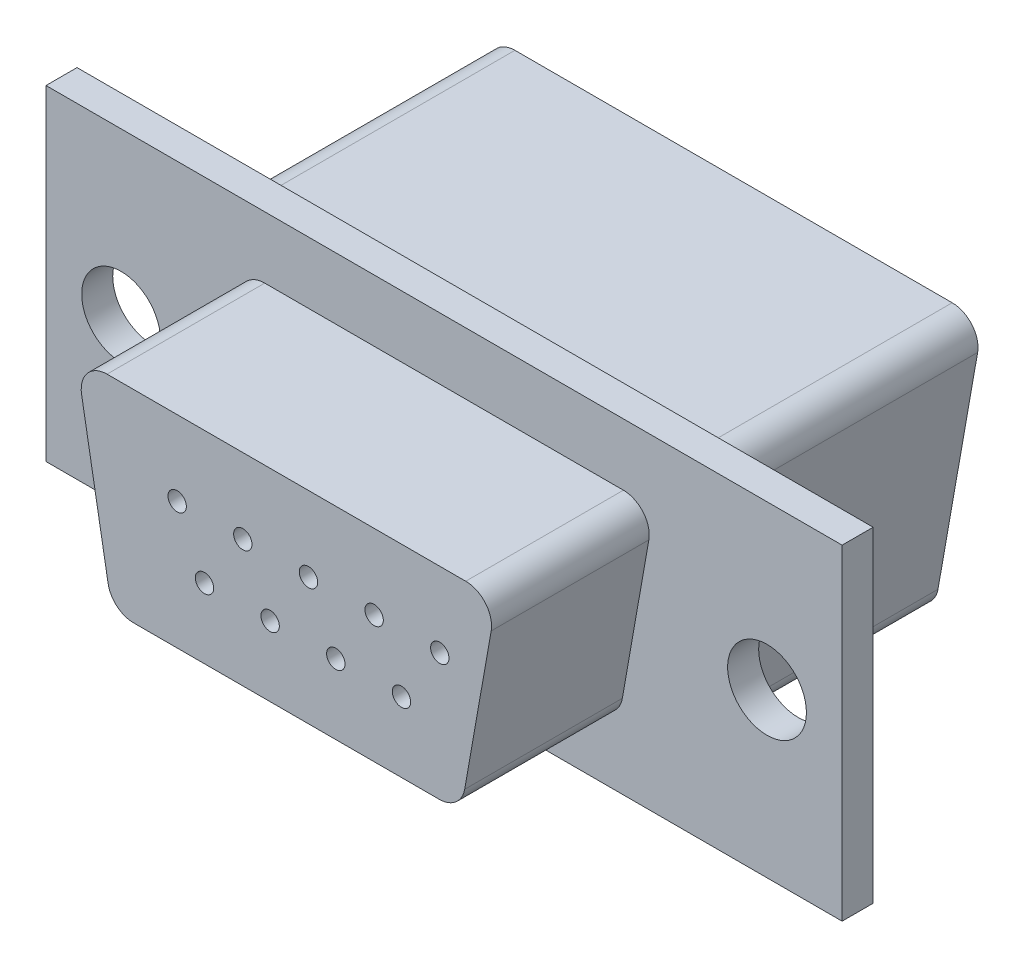
ISO-10303-21;
HEADER;
FILE_DESCRIPTION(('STEP AP214'),'2;1');
FILE_NAME('part.step','',(''),(''),'','','');
FILE_SCHEMA(('AUTOMOTIVE_DESIGN { 1 0 10303 214 1 1 1 1 }'));
ENDSEC;
DATA;
#1=APPLICATION_CONTEXT('core data for automotive mechanical design processes');
#2=APPLICATION_PROTOCOL_DEFINITION('international standard','automotive_design',2000,#1);
#3=PRODUCT_CONTEXT('',#1,'mechanical');
#4=PRODUCT('Part','Part','',(#3));
#5=PRODUCT_RELATED_PRODUCT_CATEGORY('part','',(#4));
#6=PRODUCT_DEFINITION_FORMATION('','',#4);
#7=PRODUCT_DEFINITION_CONTEXT('part definition',#1,'design');
#8=PRODUCT_DEFINITION('design','',#6,#7);
#9=PRODUCT_DEFINITION_SHAPE('','',#8);
#10=(LENGTH_UNIT() NAMED_UNIT(*) SI_UNIT(.MILLI.,.METRE.));
#11=(NAMED_UNIT(*) PLANE_ANGLE_UNIT() SI_UNIT($,.RADIAN.));
#12=(NAMED_UNIT(*) SI_UNIT($,.STERADIAN.) SOLID_ANGLE_UNIT());
#13=UNCERTAINTY_MEASURE_WITH_UNIT(LENGTH_MEASURE(1.E-05),#10,'distance_accuracy_value','');
#14=(GEOMETRIC_REPRESENTATION_CONTEXT(3) GLOBAL_UNCERTAINTY_ASSIGNED_CONTEXT((#13)) GLOBAL_UNIT_ASSIGNED_CONTEXT((#10,
#11,#12)) REPRESENTATION_CONTEXT('',''));
#15=CARTESIAN_POINT('',(0.,0.,0.));
#16=DIRECTION('',(0.,0.,1.));
#17=DIRECTION('',(1.,0.,0.));
#18=AXIS2_PLACEMENT_3D('',#15,#16,#17);
#19=CARTESIAN_POINT('',(0.,0.,0.));
#20=DIRECTION('',(0.,0.,-1.));
#21=DIRECTION('',(-1.,0.,0.));
#22=AXIS2_PLACEMENT_3D('',#19,#20,#21);
#23=PLANE('',#22);
#24=CARTESIAN_POINT('',(-12.495,0.,0.));
#25=DIRECTION('',(0.,0.,-1.));
#26=DIRECTION('',(-1.,0.,0.));
#27=AXIS2_PLACEMENT_3D('',#24,#25,#26);
#28=CIRCLE('',#27,1.52399999999999);
#29=CARTESIAN_POINT('',(-14.019,0.,0.));
#30=VERTEX_POINT('',#29);
#31=EDGE_CURVE('E496',#30,#30,#28,.T.);
#32=ORIENTED_EDGE('',*,*,#31,.F.);
#33=EDGE_LOOP('',(#32));
#34=FACE_BOUND('',#33,.T.);
#35=CARTESIAN_POINT('',(12.495,0.,0.));
#36=DIRECTION('',(0.,0.,-1.));
#37=DIRECTION('',(-1.,0.,0.));
#38=AXIS2_PLACEMENT_3D('',#35,#36,#37);
#39=CIRCLE('',#38,1.52399999999999);
#40=CARTESIAN_POINT('',(10.971,0.,0.));
#41=VERTEX_POINT('',#40);
#42=EDGE_CURVE('E204',#41,#41,#39,.T.);
#43=ORIENTED_EDGE('',*,*,#42,.F.);
#44=EDGE_LOOP('',(#43));
#45=FACE_BOUND('',#44,.T.);
#46=DIRECTION('',(0.,1.,0.));
#47=VECTOR('',#46,1.);
#48=CARTESIAN_POINT('',(15.4,-6.30000000000001,0.));
#49=LINE('',#48,#47);
#50=CARTESIAN_POINT('',(15.4,-6.30000000000001,0.));
#51=VERTEX_POINT('',#50);
#52=CARTESIAN_POINT('',(15.4,6.29999999999999,0.));
#53=VERTEX_POINT('',#52);
#54=EDGE_CURVE('E195',#51,#53,#49,.T.);
#55=ORIENTED_EDGE('',*,*,#54,.F.);
#56=DIRECTION('',(1.,0.,0.));
#57=VECTOR('',#56,1.);
#58=CARTESIAN_POINT('',(-15.4,-6.30000000000001,0.));
#59=LINE('',#58,#57);
#60=CARTESIAN_POINT('',(-15.4,-6.30000000000001,0.));
#61=VERTEX_POINT('',#60);
#62=EDGE_CURVE('E191',#61,#51,#59,.T.);
#63=ORIENTED_EDGE('',*,*,#62,.F.);
#64=DIRECTION('',(0.,-1.,0.));
#65=VECTOR('',#64,1.);
#66=CARTESIAN_POINT('',(-15.4,-6.30000000000001,0.));
#67=LINE('',#66,#65);
#68=CARTESIAN_POINT('',(-15.4,6.29999999999999,0.));
#69=VERTEX_POINT('',#68);
#70=EDGE_CURVE('E343',#69,#61,#67,.T.);
#71=ORIENTED_EDGE('',*,*,#70,.F.);
#72=DIRECTION('',(-1.,0.,0.));
#73=VECTOR('',#72,1.);
#74=CARTESIAN_POINT('',(-15.4,6.29999999999999,0.));
#75=LINE('',#74,#73);
#76=EDGE_CURVE('E341',#53,#69,#75,.T.);
#77=ORIENTED_EDGE('',*,*,#76,.F.);
#78=EDGE_LOOP('',(#55,#63,#71,#77));
#79=FACE_BOUND('',#78,.T.);
#80=DIRECTION('',(1.,0.,0.));
#81=VECTOR('',#80,1.);
#82=CARTESIAN_POINT('',(9.65,5.35,0.));
#83=LINE('',#82,#81);
#84=CARTESIAN_POINT('',(-8.4582464074058,5.35,0.));
#85=VERTEX_POINT('',#84);
#86=CARTESIAN_POINT('',(8.4582464074058,5.35,0.));
#87=VERTEX_POINT('',#86);
#88=EDGE_CURVE('E309',#85,#87,#83,.T.);
#89=ORIENTED_EDGE('',*,*,#88,.F.);
#90=CARTESIAN_POINT('',(-8.4582464074058,4.35,0.));
#91=DIRECTION('',(0.,0.,-1.));
#92=DIRECTION('',(-1.,0.,0.));
#93=AXIS2_PLACEMENT_3D('',#90,#91,#92);
#94=CIRCLE('',#93,1.);
#95=CARTESIAN_POINT('',(-9.443054160418,4.17635182233307,0.));
#96=VERTEX_POINT('',#95);
#97=EDGE_CURVE('E11',#85,#96,#94,.F.);
#98=ORIENTED_EDGE('',*,*,#97,.T.);
#99=DIRECTION('',(-0.173648177666923,0.984807753012209,0.));
#100=VECTOR('',#99,1.);
#101=CARTESIAN_POINT('',(-7.7633013064195,-5.35,0.));
#102=LINE('',#101,#100);
#103=CARTESIAN_POINT('',(-7.90900942825443,-4.52364817766692,0.));
#104=VERTEX_POINT('',#103);
#105=EDGE_CURVE('E275',#104,#96,#102,.T.);
#106=ORIENTED_EDGE('',*,*,#105,.F.);
#107=CARTESIAN_POINT('',(-6.92420167524222,-4.35,0.));
#108=DIRECTION('',(0.,0.,-1.));
#109=DIRECTION('',(-1.,0.,0.));
#110=AXIS2_PLACEMENT_3D('',#107,#108,#109);
#111=CIRCLE('',#110,1.);
#112=CARTESIAN_POINT('',(-6.92420167524221,-5.35,0.));
#113=VERTEX_POINT('',#112);
#114=EDGE_CURVE('E42',#104,#113,#111,.F.);
#115=ORIENTED_EDGE('',*,*,#114,.T.);
#116=DIRECTION('',(-1.,0.,0.));
#117=VECTOR('',#116,1.);
#118=CARTESIAN_POINT('',(7.7633013064195,-5.35,0.));
#119=LINE('',#118,#117);
#120=CARTESIAN_POINT('',(6.92420167524221,-5.35,0.));
#121=VERTEX_POINT('',#120);
#122=EDGE_CURVE('E274',#121,#113,#119,.T.);
#123=ORIENTED_EDGE('',*,*,#122,.F.);
#124=CARTESIAN_POINT('',(6.92420167524221,-4.35,0.));
#125=DIRECTION('',(0.,0.,-1.));
#126=DIRECTION('',(-1.,0.,0.));
#127=AXIS2_PLACEMENT_3D('',#124,#125,#126);
#128=CIRCLE('',#127,1.);
#129=CARTESIAN_POINT('',(7.90900942825442,-4.52364817766692,0.));
#130=VERTEX_POINT('',#129);
#131=EDGE_CURVE('E269',#121,#130,#128,.F.);
#132=ORIENTED_EDGE('',*,*,#131,.T.);
#133=DIRECTION('',(-0.173648177666924,-0.984807753012209,0.));
#134=VECTOR('',#133,1.);
#135=CARTESIAN_POINT('',(7.7633013064195,-5.35,0.));
#136=LINE('',#135,#134);
#137=CARTESIAN_POINT('',(9.44305416041801,4.17635182233308,0.));
#138=VERTEX_POINT('',#137);
#139=EDGE_CURVE('E282',#138,#130,#136,.T.);
#140=ORIENTED_EDGE('',*,*,#139,.F.);
#141=CARTESIAN_POINT('',(8.4582464074058,4.35,0.));
#142=DIRECTION('',(0.,0.,-1.));
#143=DIRECTION('',(-1.,0.,0.));
#144=AXIS2_PLACEMENT_3D('',#141,#142,#143);
#145=CIRCLE('',#144,1.);
#146=EDGE_CURVE('E271',#138,#87,#145,.F.);
#147=ORIENTED_EDGE('',*,*,#146,.T.);
#148=EDGE_LOOP('',(#89,#98,#106,#115,#123,#132,#140,#147));
#149=FACE_BOUND('',#148,.T.);
#150=ADVANCED_FACE('F34',(#34,#45,#79,#149),#23,.T.);
#151=CARTESIAN_POINT('',(0.,0.,1.2));
#152=DIRECTION('',(0.,0.,-1.));
#153=DIRECTION('',(-1.,0.,0.));
#154=AXIS2_PLACEMENT_3D('',#151,#152,#153);
#155=PLANE('',#154);
#156=CARTESIAN_POINT('',(-12.495,0.,1.2));
#157=DIRECTION('',(0.,0.,1.));
#158=DIRECTION('',(1.,0.,0.));
#159=AXIS2_PLACEMENT_3D('',#156,#157,#158);
#160=CIRCLE('',#159,1.52399999999999);
#161=CARTESIAN_POINT('',(-10.971,0.,1.2));
#162=VERTEX_POINT('',#161);
#163=EDGE_CURVE('E499',#162,#162,#160,.T.);
#164=ORIENTED_EDGE('',*,*,#163,.F.);
#165=EDGE_LOOP('',(#164));
#166=FACE_BOUND('',#165,.T.);
#167=CARTESIAN_POINT('',(12.495,0.,1.2));
#168=DIRECTION('',(0.,0.,1.));
#169=DIRECTION('',(1.,0.,0.));
#170=AXIS2_PLACEMENT_3D('',#167,#168,#169);
#171=CIRCLE('',#170,1.52399999999999);
#172=CARTESIAN_POINT('',(14.019,0.,1.2));
#173=VERTEX_POINT('',#172);
#174=EDGE_CURVE('E207',#173,#173,#171,.T.);
#175=ORIENTED_EDGE('',*,*,#174,.F.);
#176=EDGE_LOOP('',(#175));
#177=FACE_BOUND('',#176,.T.);
#178=DIRECTION('',(0.,1.,0.));
#179=VECTOR('',#178,1.);
#180=CARTESIAN_POINT('',(15.4,-6.30000000000001,1.2));
#181=LINE('',#180,#179);
#182=CARTESIAN_POINT('',(15.4,-6.30000000000001,1.2));
#183=VERTEX_POINT('',#182);
#184=CARTESIAN_POINT('',(15.4,6.29999999999999,1.2));
#185=VERTEX_POINT('',#184);
#186=EDGE_CURVE('E181',#183,#185,#181,.T.);
#187=ORIENTED_EDGE('',*,*,#186,.T.);
#188=DIRECTION('',(-1.,0.,0.));
#189=VECTOR('',#188,1.);
#190=CARTESIAN_POINT('',(-15.4,6.29999999999999,1.2));
#191=LINE('',#190,#189);
#192=CARTESIAN_POINT('',(-15.4,6.29999999999999,1.2));
#193=VERTEX_POINT('',#192);
#194=EDGE_CURVE('E170',#185,#193,#191,.T.);
#195=ORIENTED_EDGE('',*,*,#194,.T.);
#196=DIRECTION('',(0.,-1.,0.));
#197=VECTOR('',#196,1.);
#198=CARTESIAN_POINT('',(-15.4,-6.30000000000001,1.2));
#199=LINE('',#198,#197);
#200=CARTESIAN_POINT('',(-15.4,-6.30000000000001,1.2));
#201=VERTEX_POINT('',#200);
#202=EDGE_CURVE('E180',#193,#201,#199,.T.);
#203=ORIENTED_EDGE('',*,*,#202,.T.);
#204=DIRECTION('',(1.,0.,0.));
#205=VECTOR('',#204,1.);
#206=CARTESIAN_POINT('',(-15.4,-6.30000000000001,1.2));
#207=LINE('',#206,#205);
#208=EDGE_CURVE('E187',#201,#183,#207,.T.);
#209=ORIENTED_EDGE('',*,*,#208,.T.);
#210=EDGE_LOOP('',(#187,#195,#203,#209));
#211=FACE_BOUND('',#210,.T.);
#212=DIRECTION('',(0.173648177666924,0.984807753012209,0.));
#213=VECTOR('',#212,1.);
#214=CARTESIAN_POINT('',(6.75112301085986,-3.91,1.2));
#215=LINE('',#214,#213);
#216=CARTESIAN_POINT('',(6.89683113269478,-3.08364817766692,1.2));
#217=VERTEX_POINT('',#216);
#218=CARTESIAN_POINT('',(7.92305416041801,2.73635182233308,1.2));
#219=VERTEX_POINT('',#218);
#220=EDGE_CURVE('E307',#217,#219,#215,.T.);
#221=ORIENTED_EDGE('',*,*,#220,.F.);
#222=CARTESIAN_POINT('',(5.91202337968257,-2.91,1.2));
#223=DIRECTION('',(0.,0.,-1.));
#224=DIRECTION('',(-1.,0.,0.));
#225=AXIS2_PLACEMENT_3D('',#222,#223,#224);
#226=CIRCLE('',#225,1.);
#227=CARTESIAN_POINT('',(5.91202337968257,-3.91,1.2));
#228=VERTEX_POINT('',#227);
#229=EDGE_CURVE('E267',#217,#228,#226,.T.);
#230=ORIENTED_EDGE('',*,*,#229,.T.);
#231=DIRECTION('',(1.,0.,0.));
#232=VECTOR('',#231,1.);
#233=CARTESIAN_POINT('',(-6.75112301085986,-3.91,1.2));
#234=LINE('',#233,#232);
#235=CARTESIAN_POINT('',(-5.91202337968257,-3.91,1.2));
#236=VERTEX_POINT('',#235);
#237=EDGE_CURVE('E318',#236,#228,#234,.T.);
#238=ORIENTED_EDGE('',*,*,#237,.F.);
#239=CARTESIAN_POINT('',(-5.91202337968257,-2.91,1.2));
#240=DIRECTION('',(0.,0.,-1.));
#241=DIRECTION('',(-1.,0.,0.));
#242=AXIS2_PLACEMENT_3D('',#239,#240,#241);
#243=CIRCLE('',#242,1.);
#244=CARTESIAN_POINT('',(-6.89683113269478,-3.08364817766692,1.2));
#245=VERTEX_POINT('',#244);
#246=EDGE_CURVE('E263',#236,#245,#243,.T.);
#247=ORIENTED_EDGE('',*,*,#246,.T.);
#248=DIRECTION('',(0.173648177666923,-0.984807753012209,0.));
#249=VECTOR('',#248,1.);
#250=CARTESIAN_POINT('',(-6.75112301085986,-3.91,1.2));
#251=LINE('',#250,#249);
#252=CARTESIAN_POINT('',(-7.92305416041801,2.73635182233307,1.2));
#253=VERTEX_POINT('',#252);
#254=EDGE_CURVE('E332',#253,#245,#251,.T.);
#255=ORIENTED_EDGE('',*,*,#254,.F.);
#256=CARTESIAN_POINT('',(-6.9382464074058,2.91,1.2));
#257=DIRECTION('',(0.,0.,-1.));
#258=DIRECTION('',(-1.,0.,0.));
#259=AXIS2_PLACEMENT_3D('',#256,#257,#258);
#260=CIRCLE('',#259,1.);
#261=CARTESIAN_POINT('',(-6.9382464074058,3.91,1.2));
#262=VERTEX_POINT('',#261);
#263=EDGE_CURVE('E261',#253,#262,#260,.T.);
#264=ORIENTED_EDGE('',*,*,#263,.T.);
#265=DIRECTION('',(-1.,0.,0.));
#266=VECTOR('',#265,1.);
#267=CARTESIAN_POINT('',(-8.13,3.91,1.2));
#268=LINE('',#267,#266);
#269=CARTESIAN_POINT('',(6.9382464074058,3.91,1.2));
#270=VERTEX_POINT('',#269);
#271=EDGE_CURVE('E329',#270,#262,#268,.T.);
#272=ORIENTED_EDGE('',*,*,#271,.F.);
#273=CARTESIAN_POINT('',(6.9382464074058,2.91,1.2));
#274=DIRECTION('',(0.,0.,-1.));
#275=DIRECTION('',(-1.,0.,0.));
#276=AXIS2_PLACEMENT_3D('',#273,#274,#275);
#277=CIRCLE('',#276,1.);
#278=EDGE_CURVE('E265',#270,#219,#277,.T.);
#279=ORIENTED_EDGE('',*,*,#278,.T.);
#280=EDGE_LOOP('',(#221,#230,#238,#247,#255,#264,#272,#279));
#281=FACE_BOUND('',#280,.T.);
#282=ADVANCED_FACE('F184',(#166,#177,#211,#281),#155,.F.);
#283=CARTESIAN_POINT('',(15.4,-6.30000000000001,1.2));
#284=DIRECTION('',(-1.,0.,0.));
#285=DIRECTION('',(0.,0.,1.));
#286=AXIS2_PLACEMENT_3D('',#283,#284,#285);
#287=PLANE('',#286);
#288=ORIENTED_EDGE('',*,*,#54,.T.);
#289=DIRECTION('',(0.,0.,-1.));
#290=VECTOR('',#289,1.);
#291=CARTESIAN_POINT('',(15.4,6.29999999999999,1.2));
#292=LINE('',#291,#290);
#293=EDGE_CURVE('E174',#185,#53,#292,.T.);
#294=ORIENTED_EDGE('',*,*,#293,.F.);
#295=ORIENTED_EDGE('',*,*,#186,.F.);
#296=DIRECTION('',(0.,0.,-1.));
#297=VECTOR('',#296,1.);
#298=CARTESIAN_POINT('',(15.4,-6.30000000000001,1.2));
#299=LINE('',#298,#297);
#300=EDGE_CURVE('E339',#183,#51,#299,.T.);
#301=ORIENTED_EDGE('',*,*,#300,.T.);
#302=EDGE_LOOP('',(#288,#294,#295,#301));
#303=FACE_BOUND('',#302,.T.);
#304=ADVANCED_FACE('F193',(#303),#287,.F.);
#305=CARTESIAN_POINT('',(-15.4,6.29999999999999,1.2));
#306=DIRECTION('',(0.,-1.,0.));
#307=DIRECTION('',(0.,0.,-1.));
#308=AXIS2_PLACEMENT_3D('',#305,#306,#307);
#309=PLANE('',#308);
#310=ORIENTED_EDGE('',*,*,#76,.T.);
#311=DIRECTION('',(0.,0.,-1.));
#312=VECTOR('',#311,1.);
#313=CARTESIAN_POINT('',(-15.4,6.29999999999999,1.2));
#314=LINE('',#313,#312);
#315=EDGE_CURVE('E177',#193,#69,#314,.T.);
#316=ORIENTED_EDGE('',*,*,#315,.F.);
#317=ORIENTED_EDGE('',*,*,#194,.F.);
#318=ORIENTED_EDGE('',*,*,#293,.T.);
#319=EDGE_LOOP('',(#310,#316,#317,#318));
#320=FACE_BOUND('',#319,.T.);
#321=ADVANCED_FACE('F172',(#320),#309,.F.);
#322=CARTESIAN_POINT('',(-15.4,-6.30000000000001,1.2));
#323=DIRECTION('',(1.,0.,0.));
#324=DIRECTION('',(0.,0.,-1.));
#325=AXIS2_PLACEMENT_3D('',#322,#323,#324);
#326=PLANE('',#325);
#327=ORIENTED_EDGE('',*,*,#70,.T.);
#328=DIRECTION('',(0.,0.,-1.));
#329=VECTOR('',#328,1.);
#330=CARTESIAN_POINT('',(-15.4,-6.30000000000001,1.2));
#331=LINE('',#330,#329);
#332=EDGE_CURVE('E200',#201,#61,#331,.T.);
#333=ORIENTED_EDGE('',*,*,#332,.F.);
#334=ORIENTED_EDGE('',*,*,#202,.F.);
#335=ORIENTED_EDGE('',*,*,#315,.T.);
#336=EDGE_LOOP('',(#327,#333,#334,#335));
#337=FACE_BOUND('',#336,.T.);
#338=ADVANCED_FACE('F354',(#337),#326,.F.);
#339=CARTESIAN_POINT('',(-15.4,-6.30000000000001,1.2));
#340=DIRECTION('',(0.,1.,0.));
#341=DIRECTION('',(0.,0.,1.));
#342=AXIS2_PLACEMENT_3D('',#339,#340,#341);
#343=PLANE('',#342);
#344=ORIENTED_EDGE('',*,*,#62,.T.);
#345=ORIENTED_EDGE('',*,*,#300,.F.);
#346=ORIENTED_EDGE('',*,*,#208,.F.);
#347=ORIENTED_EDGE('',*,*,#332,.T.);
#348=EDGE_LOOP('',(#344,#345,#346,#347));
#349=FACE_BOUND('',#348,.T.);
#350=ADVANCED_FACE('F350',(#349),#343,.F.);
#351=CARTESIAN_POINT('',(6.75112301085986,-3.91,7.3));
#352=DIRECTION('',(-0.984807753012209,0.173648177666924,0.));
#353=DIRECTION('',(-0.173648177666924,-0.984807753012209,0.));
#354=AXIS2_PLACEMENT_3D('',#351,#352,#353);
#355=PLANE('',#354);
#356=ORIENTED_EDGE('',*,*,#220,.T.);
#357=DIRECTION('',(0.,0.,-1.));
#358=VECTOR('',#357,1.);
#359=CARTESIAN_POINT('',(7.92305416041801,2.73635182233308,7.3));
#360=LINE('',#359,#358);
#361=CARTESIAN_POINT('',(7.92305416041801,2.73635182233308,7.3));
#362=VERTEX_POINT('',#361);
#363=EDGE_CURVE('E232',#219,#362,#360,.F.);
#364=ORIENTED_EDGE('',*,*,#363,.T.);
#365=DIRECTION('',(0.173648177666924,0.984807753012209,0.));
#366=VECTOR('',#365,1.);
#367=CARTESIAN_POINT('',(6.75112301085986,-3.91,7.3));
#368=LINE('',#367,#366);
#369=CARTESIAN_POINT('',(6.89683113269478,-3.08364817766692,7.3));
#370=VERTEX_POINT('',#369);
#371=EDGE_CURVE('E314',#370,#362,#368,.T.);
#372=ORIENTED_EDGE('',*,*,#371,.F.);
#373=DIRECTION('',(0.,0.,-1.));
#374=VECTOR('',#373,1.);
#375=CARTESIAN_POINT('',(6.89683113269478,-3.08364817766692,7.3));
#376=LINE('',#375,#374);
#377=EDGE_CURVE('E229',#370,#217,#376,.T.);
#378=ORIENTED_EDGE('',*,*,#377,.T.);
#379=EDGE_LOOP('',(#356,#364,#372,#378));
#380=FACE_BOUND('',#379,.T.);
#381=ADVANCED_FACE('F361',(#380),#355,.F.);
#382=CARTESIAN_POINT('',(-8.13,3.91,7.3));
#383=DIRECTION('',(0.,-1.,0.));
#384=DIRECTION('',(0.,0.,-1.));
#385=AXIS2_PLACEMENT_3D('',#382,#383,#384);
#386=PLANE('',#385);
#387=ORIENTED_EDGE('',*,*,#271,.T.);
#388=DIRECTION('',(0.,0.,-1.));
#389=VECTOR('',#388,1.);
#390=CARTESIAN_POINT('',(-6.9382464074058,3.91,7.3));
#391=LINE('',#390,#389);
#392=CARTESIAN_POINT('',(-6.9382464074058,3.91,7.3));
#393=VERTEX_POINT('',#392);
#394=EDGE_CURVE('E214',#262,#393,#391,.F.);
#395=ORIENTED_EDGE('',*,*,#394,.T.);
#396=DIRECTION('',(-1.,0.,0.));
#397=VECTOR('',#396,1.);
#398=CARTESIAN_POINT('',(-8.13,3.91,7.3));
#399=LINE('',#398,#397);
#400=CARTESIAN_POINT('',(6.9382464074058,3.91,7.3));
#401=VERTEX_POINT('',#400);
#402=EDGE_CURVE('E317',#401,#393,#399,.T.);
#403=ORIENTED_EDGE('',*,*,#402,.F.);
#404=DIRECTION('',(0.,0.,-1.));
#405=VECTOR('',#404,1.);
#406=CARTESIAN_POINT('',(6.9382464074058,3.91,7.3));
#407=LINE('',#406,#405);
#408=EDGE_CURVE('E211',#401,#270,#407,.T.);
#409=ORIENTED_EDGE('',*,*,#408,.T.);
#410=EDGE_LOOP('',(#387,#395,#403,#409));
#411=FACE_BOUND('',#410,.T.);
#412=ADVANCED_FACE('F378',(#411),#386,.F.);
#413=CARTESIAN_POINT('',(-6.75112301085986,-3.91,7.3));
#414=DIRECTION('',(0.984807753012209,0.173648177666923,0.));
#415=DIRECTION('',(-0.173648177666923,0.984807753012209,0.));
#416=AXIS2_PLACEMENT_3D('',#413,#414,#415);
#417=PLANE('',#416);
#418=DIRECTION('',(0.173648177666923,-0.984807753012209,0.));
#419=VECTOR('',#418,1.);
#420=CARTESIAN_POINT('',(-6.75112301085986,-3.91,7.3));
#421=LINE('',#420,#419);
#422=CARTESIAN_POINT('',(-7.92305416041801,2.73635182233307,7.3));
#423=VERTEX_POINT('',#422);
#424=CARTESIAN_POINT('',(-6.89683113269478,-3.08364817766692,7.3));
#425=VERTEX_POINT('',#424);
#426=EDGE_CURVE('E321',#423,#425,#421,.T.);
#427=ORIENTED_EDGE('',*,*,#426,.F.);
#428=DIRECTION('',(0.,0.,-1.));
#429=VECTOR('',#428,1.);
#430=CARTESIAN_POINT('',(-7.92305416041801,2.73635182233308,7.3));
#431=LINE('',#430,#429);
#432=EDGE_CURVE('E198',#423,#253,#431,.T.);
#433=ORIENTED_EDGE('',*,*,#432,.T.);
#434=ORIENTED_EDGE('',*,*,#254,.T.);
#435=DIRECTION('',(0.,0.,-1.));
#436=VECTOR('',#435,1.);
#437=CARTESIAN_POINT('',(-6.89683113269478,-3.08364817766692,7.3));
#438=LINE('',#437,#436);
#439=EDGE_CURVE('E196',#245,#425,#438,.F.);
#440=ORIENTED_EDGE('',*,*,#439,.T.);
#441=EDGE_LOOP('',(#427,#433,#434,#440));
#442=FACE_BOUND('',#441,.T.);
#443=ADVANCED_FACE('F382',(#442),#417,.F.);
#444=CARTESIAN_POINT('',(-6.75112301085986,-3.91,7.3));
#445=DIRECTION('',(0.,1.,0.));
#446=DIRECTION('',(0.,0.,1.));
#447=AXIS2_PLACEMENT_3D('',#444,#445,#446);
#448=PLANE('',#447);
#449=DIRECTION('',(1.,0.,0.));
#450=VECTOR('',#449,1.);
#451=CARTESIAN_POINT('',(-6.75112301085986,-3.91,7.3));
#452=LINE('',#451,#450);
#453=CARTESIAN_POINT('',(-5.91202337968257,-3.91,7.3));
#454=VERTEX_POINT('',#453);
#455=CARTESIAN_POINT('',(5.91202337968257,-3.91,7.3));
#456=VERTEX_POINT('',#455);
#457=EDGE_CURVE('E324',#454,#456,#452,.T.);
#458=ORIENTED_EDGE('',*,*,#457,.F.);
#459=DIRECTION('',(0.,0.,-1.));
#460=VECTOR('',#459,1.);
#461=CARTESIAN_POINT('',(-5.91202337968257,-3.91,7.3));
#462=LINE('',#461,#460);
#463=EDGE_CURVE('E226',#454,#236,#462,.T.);
#464=ORIENTED_EDGE('',*,*,#463,.T.);
#465=ORIENTED_EDGE('',*,*,#237,.T.);
#466=DIRECTION('',(0.,0.,-1.));
#467=VECTOR('',#466,1.);
#468=CARTESIAN_POINT('',(5.91202337968257,-3.91,7.3));
#469=LINE('',#468,#467);
#470=EDGE_CURVE('E224',#228,#456,#469,.F.);
#471=ORIENTED_EDGE('',*,*,#470,.T.);
#472=EDGE_LOOP('',(#458,#464,#465,#471));
#473=FACE_BOUND('',#472,.T.);
#474=ADVANCED_FACE('F386',(#473),#448,.F.);
#475=CARTESIAN_POINT('',(0.,0.,7.3));
#476=DIRECTION('',(0.,0.,-1.));
#477=DIRECTION('',(-1.,0.,0.));
#478=AXIS2_PLACEMENT_3D('',#475,#476,#477);
#479=PLANE('',#478);
#480=CARTESIAN_POINT('',(4.45167887602831,-1.20281050529179,7.3));
#481=DIRECTION('',(0.,0.,-1.));
#482=DIRECTION('',(-1.,0.,0.));
#483=AXIS2_PLACEMENT_3D('',#480,#481,#482);
#484=CIRCLE('',#483,0.355599999999998);
#485=CARTESIAN_POINT('',(4.09607887602831,-1.20281050529179,7.3));
#486=VERTEX_POINT('',#485);
#487=EDGE_CURVE('E507',#486,#486,#484,.T.);
#488=ORIENTED_EDGE('',*,*,#487,.T.);
#489=EDGE_LOOP('',(#488));
#490=FACE_BOUND('',#489,.T.);
#491=CARTESIAN_POINT('',(1.91167887602831,-1.20281050529179,7.3));
#492=DIRECTION('',(0.,0.,-1.));
#493=DIRECTION('',(-1.,0.,0.));
#494=AXIS2_PLACEMENT_3D('',#491,#492,#493);
#495=CIRCLE('',#494,0.355599999999998);
#496=CARTESIAN_POINT('',(1.55607887602831,-1.20281050529179,7.3));
#497=VERTEX_POINT('',#496);
#498=EDGE_CURVE('E513',#497,#497,#495,.T.);
#499=ORIENTED_EDGE('',*,*,#498,.T.);
#500=EDGE_LOOP('',(#499));
#501=FACE_BOUND('',#500,.T.);
#502=CARTESIAN_POINT('',(-0.628321123971693,-1.20281050529179,7.3));
#503=DIRECTION('',(0.,0.,-1.));
#504=DIRECTION('',(-1.,0.,0.));
#505=AXIS2_PLACEMENT_3D('',#502,#503,#504);
#506=CIRCLE('',#505,0.355599999999998);
#507=CARTESIAN_POINT('',(-0.983921123971691,-1.20281050529179,7.3));
#508=VERTEX_POINT('',#507);
#509=EDGE_CURVE('E519',#508,#508,#506,.T.);
#510=ORIENTED_EDGE('',*,*,#509,.T.);
#511=EDGE_LOOP('',(#510));
#512=FACE_BOUND('',#511,.T.);
#513=CARTESIAN_POINT('',(5.93456068376066,1.00800793848367,7.3));
#514=DIRECTION('',(0.,0.,-1.));
#515=DIRECTION('',(-1.,0.,0.));
#516=AXIS2_PLACEMENT_3D('',#513,#514,#515);
#517=CIRCLE('',#516,0.355599999999998);
#518=CARTESIAN_POINT('',(5.57896068376066,1.00800793848367,7.3));
#519=VERTEX_POINT('',#518);
#520=EDGE_CURVE('E525',#519,#519,#517,.T.);
#521=ORIENTED_EDGE('',*,*,#520,.T.);
#522=EDGE_LOOP('',(#521));
#523=FACE_BOUND('',#522,.T.);
#524=CARTESIAN_POINT('',(3.39456068376066,1.00800793848367,7.3));
#525=DIRECTION('',(0.,0.,-1.));
#526=DIRECTION('',(-1.,0.,0.));
#527=AXIS2_PLACEMENT_3D('',#524,#525,#526);
#528=CIRCLE('',#527,0.355599999999998);
#529=CARTESIAN_POINT('',(3.03896068376066,1.00800793848367,7.3));
#530=VERTEX_POINT('',#529);
#531=EDGE_CURVE('E531',#530,#530,#528,.T.);
#532=ORIENTED_EDGE('',*,*,#531,.T.);
#533=EDGE_LOOP('',(#532));
#534=FACE_BOUND('',#533,.T.);
#535=CARTESIAN_POINT('',(0.854560683760659,1.00800793848367,7.3));
#536=DIRECTION('',(0.,0.,-1.));
#537=DIRECTION('',(-1.,0.,0.));
#538=AXIS2_PLACEMENT_3D('',#535,#536,#537);
#539=CIRCLE('',#538,0.355599999999998);
#540=CARTESIAN_POINT('',(0.498960683760661,1.00800793848367,7.3));
#541=VERTEX_POINT('',#540);
#542=EDGE_CURVE('E537',#541,#541,#539,.T.);
#543=ORIENTED_EDGE('',*,*,#542,.T.);
#544=EDGE_LOOP('',(#543));
#545=FACE_BOUND('',#544,.T.);
#546=CARTESIAN_POINT('',(-1.68543931623934,1.00800793848367,7.3));
#547=DIRECTION('',(0.,0.,-1.));
#548=DIRECTION('',(-1.,0.,0.));
#549=AXIS2_PLACEMENT_3D('',#546,#547,#548);
#550=CIRCLE('',#549,0.355599999999998);
#551=CARTESIAN_POINT('',(-2.04103931623934,1.00800793848367,7.3));
#552=VERTEX_POINT('',#551);
#553=EDGE_CURVE('E543',#552,#552,#550,.T.);
#554=ORIENTED_EDGE('',*,*,#553,.T.);
#555=EDGE_LOOP('',(#554));
#556=FACE_BOUND('',#555,.T.);
#557=CARTESIAN_POINT('',(-3.16832112397169,-1.20281050529179,7.3));
#558=DIRECTION('',(0.,0.,-1.));
#559=DIRECTION('',(-1.,0.,0.));
#560=AXIS2_PLACEMENT_3D('',#557,#558,#559);
#561=CIRCLE('',#560,0.355599999999998);
#562=CARTESIAN_POINT('',(-3.52392112397169,-1.20281050529179,7.3));
#563=VERTEX_POINT('',#562);
#564=EDGE_CURVE('E549',#563,#563,#561,.T.);
#565=ORIENTED_EDGE('',*,*,#564,.T.);
#566=EDGE_LOOP('',(#565));
#567=FACE_BOUND('',#566,.T.);
#568=CARTESIAN_POINT('',(-4.22543931623934,1.00800793848367,7.3));
#569=DIRECTION('',(0.,0.,-1.));
#570=DIRECTION('',(-1.,0.,0.));
#571=AXIS2_PLACEMENT_3D('',#568,#569,#570);
#572=CIRCLE('',#571,0.355599999999998);
#573=CARTESIAN_POINT('',(-4.58103931623934,1.00800793848367,7.3));
#574=VERTEX_POINT('',#573);
#575=EDGE_CURVE('E302',#574,#574,#572,.T.);
#576=ORIENTED_EDGE('',*,*,#575,.T.);
#577=EDGE_LOOP('',(#576));
#578=FACE_BOUND('',#577,.T.);
#579=ORIENTED_EDGE('',*,*,#402,.T.);
#580=CARTESIAN_POINT('',(-6.9382464074058,2.91,7.3));
#581=DIRECTION('',(0.,0.,-1.));
#582=DIRECTION('',(-1.,0.,0.));
#583=AXIS2_PLACEMENT_3D('',#580,#581,#582);
#584=CIRCLE('',#583,1.);
#585=EDGE_CURVE('E222',#393,#423,#584,.F.);
#586=ORIENTED_EDGE('',*,*,#585,.T.);
#587=ORIENTED_EDGE('',*,*,#426,.T.);
#588=CARTESIAN_POINT('',(-5.91202337968257,-2.91,7.3));
#589=DIRECTION('',(0.,0.,-1.));
#590=DIRECTION('',(-1.,0.,0.));
#591=AXIS2_PLACEMENT_3D('',#588,#589,#590);
#592=CIRCLE('',#591,1.);
#593=EDGE_CURVE('E220',#425,#454,#592,.F.);
#594=ORIENTED_EDGE('',*,*,#593,.T.);
#595=ORIENTED_EDGE('',*,*,#457,.T.);
#596=CARTESIAN_POINT('',(5.91202337968257,-2.91,7.3));
#597=DIRECTION('',(0.,0.,-1.));
#598=DIRECTION('',(-1.,0.,0.));
#599=AXIS2_PLACEMENT_3D('',#596,#597,#598);
#600=CIRCLE('',#599,1.);
#601=EDGE_CURVE('E216',#456,#370,#600,.F.);
#602=ORIENTED_EDGE('',*,*,#601,.T.);
#603=ORIENTED_EDGE('',*,*,#371,.T.);
#604=CARTESIAN_POINT('',(6.9382464074058,2.91,7.3));
#605=DIRECTION('',(0.,0.,-1.));
#606=DIRECTION('',(-1.,0.,0.));
#607=AXIS2_PLACEMENT_3D('',#604,#605,#606);
#608=CIRCLE('',#607,1.);
#609=EDGE_CURVE('E218',#362,#401,#608,.F.);
#610=ORIENTED_EDGE('',*,*,#609,.T.);
#611=EDGE_LOOP('',(#579,#586,#587,#594,#595,#602,#603,#610));
#612=FACE_BOUND('',#611,.T.);
#613=ADVANCED_FACE('F390',(#490,#501,#512,#523,#534,#545,#556,#567,#578,#612),#479,.F.);
#614=CARTESIAN_POINT('',(-7.7633013064195,-5.35,-10.));
#615=DIRECTION('',(0.984807753012209,0.173648177666923,0.));
#616=DIRECTION('',(-0.173648177666923,0.984807753012209,0.));
#617=AXIS2_PLACEMENT_3D('',#614,#615,#616);
#618=PLANE('',#617);
#619=DIRECTION('',(-0.173648177666923,0.984807753012209,0.));
#620=VECTOR('',#619,1.);
#621=CARTESIAN_POINT('',(-7.7633013064195,-5.35,-10.));
#622=LINE('',#621,#620);
#623=CARTESIAN_POINT('',(-7.90900942825443,-4.52364817766692,-10.));
#624=VERTEX_POINT('',#623);
#625=CARTESIAN_POINT('',(-9.443054160418,4.17635182233307,-10.));
#626=VERTEX_POINT('',#625);
#627=EDGE_CURVE('E281',#624,#626,#622,.T.);
#628=ORIENTED_EDGE('',*,*,#627,.F.);
#629=DIRECTION('',(0.,0.,1.));
#630=VECTOR('',#629,1.);
#631=CARTESIAN_POINT('',(-7.90900942825443,-4.52364817766692,-10.));
#632=LINE('',#631,#630);
#633=EDGE_CURVE('E259',#624,#104,#632,.T.);
#634=ORIENTED_EDGE('',*,*,#633,.T.);
#635=ORIENTED_EDGE('',*,*,#105,.T.);
#636=DIRECTION('',(0.,0.,1.));
#637=VECTOR('',#636,1.);
#638=CARTESIAN_POINT('',(-9.443054160418,4.17635182233308,-10.));
#639=LINE('',#638,#637);
#640=EDGE_CURVE('E257',#96,#626,#639,.F.);
#641=ORIENTED_EDGE('',*,*,#640,.T.);
#642=EDGE_LOOP('',(#628,#634,#635,#641));
#643=FACE_BOUND('',#642,.T.);
#644=ADVANCED_FACE('F294',(#643),#618,.F.);
#645=CARTESIAN_POINT('',(9.65,5.35,-10.));
#646=DIRECTION('',(0.,-1.,0.));
#647=DIRECTION('',(0.,0.,-1.));
#648=AXIS2_PLACEMENT_3D('',#645,#646,#647);
#649=PLANE('',#648);
#650=ORIENTED_EDGE('',*,*,#88,.T.);
#651=DIRECTION('',(0.,0.,1.));
#652=VECTOR('',#651,1.);
#653=CARTESIAN_POINT('',(8.4582464074058,5.35,-10.));
#654=LINE('',#653,#652);
#655=CARTESIAN_POINT('',(8.4582464074058,5.35,-10.));
#656=VERTEX_POINT('',#655);
#657=EDGE_CURVE('E255',#87,#656,#654,.F.);
#658=ORIENTED_EDGE('',*,*,#657,.T.);
#659=DIRECTION('',(1.,0.,0.));
#660=VECTOR('',#659,1.);
#661=CARTESIAN_POINT('',(9.65,5.35,-10.));
#662=LINE('',#661,#660);
#663=CARTESIAN_POINT('',(-8.4582464074058,5.35,-10.));
#664=VERTEX_POINT('',#663);
#665=EDGE_CURVE('E296',#664,#656,#662,.T.);
#666=ORIENTED_EDGE('',*,*,#665,.F.);
#667=DIRECTION('',(0.,0.,1.));
#668=VECTOR('',#667,1.);
#669=CARTESIAN_POINT('',(-8.4582464074058,5.35,-10.));
#670=LINE('',#669,#668);
#671=EDGE_CURVE('E252',#664,#85,#670,.T.);
#672=ORIENTED_EDGE('',*,*,#671,.T.);
#673=EDGE_LOOP('',(#650,#658,#666,#672));
#674=FACE_BOUND('',#673,.T.);
#675=ADVANCED_FACE('F397',(#674),#649,.F.);
#676=CARTESIAN_POINT('',(7.7633013064195,-5.35,-10.));
#677=DIRECTION('',(-0.984807753012209,0.173648177666924,0.));
#678=DIRECTION('',(-0.173648177666924,-0.984807753012209,0.));
#679=AXIS2_PLACEMENT_3D('',#676,#677,#678);
#680=PLANE('',#679);
#681=ORIENTED_EDGE('',*,*,#139,.T.);
#682=DIRECTION('',(0.,0.,1.));
#683=VECTOR('',#682,1.);
#684=CARTESIAN_POINT('',(7.90900942825442,-4.52364817766692,-10.));
#685=LINE('',#684,#683);
#686=CARTESIAN_POINT('',(7.90900942825442,-4.52364817766692,-10.));
#687=VERTEX_POINT('',#686);
#688=EDGE_CURVE('E242',#130,#687,#685,.F.);
#689=ORIENTED_EDGE('',*,*,#688,.T.);
#690=DIRECTION('',(-0.173648177666924,-0.984807753012209,0.));
#691=VECTOR('',#690,1.);
#692=CARTESIAN_POINT('',(7.7633013064195,-5.35,-10.));
#693=LINE('',#692,#691);
#694=CARTESIAN_POINT('',(9.44305416041801,4.17635182233308,-10.));
#695=VERTEX_POINT('',#694);
#696=EDGE_CURVE('E299',#695,#687,#693,.T.);
#697=ORIENTED_EDGE('',*,*,#696,.F.);
#698=DIRECTION('',(0.,0.,1.));
#699=VECTOR('',#698,1.);
#700=CARTESIAN_POINT('',(9.44305416041801,4.17635182233308,-10.));
#701=LINE('',#700,#699);
#702=EDGE_CURVE('E239',#695,#138,#701,.T.);
#703=ORIENTED_EDGE('',*,*,#702,.T.);
#704=EDGE_LOOP('',(#681,#689,#697,#703));
#705=FACE_BOUND('',#704,.T.);
#706=ADVANCED_FACE('F400',(#705),#680,.F.);
#707=CARTESIAN_POINT('',(7.7633013064195,-5.35,-10.));
#708=DIRECTION('',(0.,1.,0.));
#709=DIRECTION('',(-1.,0.,0.));
#710=AXIS2_PLACEMENT_3D('',#707,#708,#709);
#711=PLANE('',#710);
#712=DIRECTION('',(-1.,0.,0.));
#713=VECTOR('',#712,1.);
#714=CARTESIAN_POINT('',(7.7633013064195,-5.35,-10.));
#715=LINE('',#714,#713);
#716=CARTESIAN_POINT('',(6.92420167524221,-5.35,-10.));
#717=VERTEX_POINT('',#716);
#718=CARTESIAN_POINT('',(-6.92420167524221,-5.35,-10.));
#719=VERTEX_POINT('',#718);
#720=EDGE_CURVE('E292',#717,#719,#715,.T.);
#721=ORIENTED_EDGE('',*,*,#720,.F.);
#722=DIRECTION('',(0.,0.,1.));
#723=VECTOR('',#722,1.);
#724=CARTESIAN_POINT('',(6.92420167524221,-5.35,-10.));
#725=LINE('',#724,#723);
#726=EDGE_CURVE('E236',#717,#121,#725,.T.);
#727=ORIENTED_EDGE('',*,*,#726,.T.);
#728=ORIENTED_EDGE('',*,*,#122,.T.);
#729=DIRECTION('',(0.,0.,1.));
#730=VECTOR('',#729,1.);
#731=CARTESIAN_POINT('',(-6.92420167524222,-5.35,-10.));
#732=LINE('',#731,#730);
#733=EDGE_CURVE('E234',#113,#719,#732,.F.);
#734=ORIENTED_EDGE('',*,*,#733,.T.);
#735=EDGE_LOOP('',(#721,#727,#728,#734));
#736=FACE_BOUND('',#735,.T.);
#737=ADVANCED_FACE('F278',(#736),#711,.F.);
#738=CARTESIAN_POINT('',(0.,0.,-10.));
#739=DIRECTION('',(0.,0.,1.));
#740=DIRECTION('',(1.,0.,0.));
#741=AXIS2_PLACEMENT_3D('',#738,#739,#740);
#742=PLANE('',#741);
#743=ORIENTED_EDGE('',*,*,#696,.T.);
#744=CARTESIAN_POINT('',(6.92420167524221,-4.35,-10.));
#745=DIRECTION('',(0.,0.,1.));
#746=DIRECTION('',(1.,0.,0.));
#747=AXIS2_PLACEMENT_3D('',#744,#745,#746);
#748=CIRCLE('',#747,1.);
#749=EDGE_CURVE('E250',#687,#717,#748,.F.);
#750=ORIENTED_EDGE('',*,*,#749,.T.);
#751=ORIENTED_EDGE('',*,*,#720,.T.);
#752=CARTESIAN_POINT('',(-6.92420167524222,-4.35,-10.));
#753=DIRECTION('',(0.,0.,1.));
#754=DIRECTION('',(1.,0.,0.));
#755=AXIS2_PLACEMENT_3D('',#752,#753,#754);
#756=CIRCLE('',#755,1.);
#757=EDGE_CURVE('E246',#719,#624,#756,.F.);
#758=ORIENTED_EDGE('',*,*,#757,.T.);
#759=ORIENTED_EDGE('',*,*,#627,.T.);
#760=CARTESIAN_POINT('',(-8.4582464074058,4.35,-10.));
#761=DIRECTION('',(0.,0.,1.));
#762=DIRECTION('',(1.,0.,0.));
#763=AXIS2_PLACEMENT_3D('',#760,#761,#762);
#764=CIRCLE('',#763,1.);
#765=EDGE_CURVE('E244',#626,#664,#764,.F.);
#766=ORIENTED_EDGE('',*,*,#765,.T.);
#767=ORIENTED_EDGE('',*,*,#665,.T.);
#768=CARTESIAN_POINT('',(8.4582464074058,4.35,-10.));
#769=DIRECTION('',(0.,0.,1.));
#770=DIRECTION('',(1.,0.,0.));
#771=AXIS2_PLACEMENT_3D('',#768,#769,#770);
#772=CIRCLE('',#771,1.);
#773=EDGE_CURVE('E248',#656,#695,#772,.F.);
#774=ORIENTED_EDGE('',*,*,#773,.T.);
#775=EDGE_LOOP('',(#743,#750,#751,#758,#759,#766,#767,#774));
#776=FACE_BOUND('',#775,.T.);
#777=ADVANCED_FACE('F290',(#776),#742,.F.);
#778=CARTESIAN_POINT('',(-3.86983931623935,1.00800793848367,1.2));
#779=DIRECTION('',(0.,0.,-1.));
#780=DIRECTION('',(-1.,0.,0.));
#781=AXIS2_PLACEMENT_3D('',#778,#779,#780);
#782=PLANE('',#781);
#783=CARTESIAN_POINT('',(-4.22543931623934,1.00800793848367,1.2));
#784=DIRECTION('',(0.,0.,-1.));
#785=DIRECTION('',(-1.,0.,0.));
#786=AXIS2_PLACEMENT_3D('',#783,#784,#785);
#787=CIRCLE('',#786,0.355599999999987);
#788=CARTESIAN_POINT('',(-4.58103931623933,1.00800793848367,1.2));
#789=VERTEX_POINT('',#788);
#790=EDGE_CURVE('E551',#789,#789,#787,.T.);
#791=ORIENTED_EDGE('',*,*,#790,.F.);
#792=EDGE_LOOP('',(#791));
#793=FACE_BOUND('',#792,.T.);
#794=ADVANCED_FACE('F409',(#793),#782,.F.);
#795=CARTESIAN_POINT('',(-4.22543931623934,1.00800793848367,1.2));
#796=DIRECTION('',(0.,0.,-1.));
#797=DIRECTION('',(-1.,0.,0.));
#798=AXIS2_PLACEMENT_3D('',#795,#796,#797);
#799=CYLINDRICAL_SURFACE('',#798,0.355599999999993);
#800=ORIENTED_EDGE('',*,*,#575,.F.);
#801=EDGE_LOOP('',(#800));
#802=FACE_BOUND('',#801,.T.);
#803=ORIENTED_EDGE('',*,*,#790,.T.);
#804=EDGE_LOOP('',(#803));
#805=FACE_BOUND('',#804,.T.);
#806=ADVANCED_FACE('F412',(#802,#805),#799,.F.);
#807=CARTESIAN_POINT('',(-2.81272112397171,-1.20281050529179,1.2));
#808=DIRECTION('',(0.,0.,-1.));
#809=DIRECTION('',(-1.,0.,0.));
#810=AXIS2_PLACEMENT_3D('',#807,#808,#809);
#811=PLANE('',#810);
#812=CARTESIAN_POINT('',(-3.16832112397169,-1.20281050529179,1.2));
#813=DIRECTION('',(0.,0.,-1.));
#814=DIRECTION('',(-1.,0.,0.));
#815=AXIS2_PLACEMENT_3D('',#812,#813,#814);
#816=CIRCLE('',#815,0.355599999999987);
#817=CARTESIAN_POINT('',(-3.52392112397168,-1.20281050529179,1.2));
#818=VERTEX_POINT('',#817);
#819=EDGE_CURVE('E546',#818,#818,#816,.T.);
#820=ORIENTED_EDGE('',*,*,#819,.F.);
#821=EDGE_LOOP('',(#820));
#822=FACE_BOUND('',#821,.T.);
#823=ADVANCED_FACE('F416',(#822),#811,.F.);
#824=CARTESIAN_POINT('',(-3.16832112397169,-1.20281050529179,1.2));
#825=DIRECTION('',(0.,0.,-1.));
#826=DIRECTION('',(-1.,0.,0.));
#827=AXIS2_PLACEMENT_3D('',#824,#825,#826);
#828=CYLINDRICAL_SURFACE('',#827,0.355599999999993);
#829=ORIENTED_EDGE('',*,*,#564,.F.);
#830=EDGE_LOOP('',(#829));
#831=FACE_BOUND('',#830,.T.);
#832=ORIENTED_EDGE('',*,*,#819,.T.);
#833=EDGE_LOOP('',(#832));
#834=FACE_BOUND('',#833,.T.);
#835=ADVANCED_FACE('F420',(#831,#834),#828,.F.);
#836=CARTESIAN_POINT('',(-1.32983931623935,1.00800793848367,1.2));
#837=DIRECTION('',(0.,0.,-1.));
#838=DIRECTION('',(-1.,0.,0.));
#839=AXIS2_PLACEMENT_3D('',#836,#837,#838);
#840=PLANE('',#839);
#841=CARTESIAN_POINT('',(-1.68543931623934,1.00800793848367,1.2));
#842=DIRECTION('',(0.,0.,-1.));
#843=DIRECTION('',(-1.,0.,0.));
#844=AXIS2_PLACEMENT_3D('',#841,#842,#843);
#845=CIRCLE('',#844,0.355599999999987);
#846=CARTESIAN_POINT('',(-2.04103931623933,1.00800793848367,1.2));
#847=VERTEX_POINT('',#846);
#848=EDGE_CURVE('E540',#847,#847,#845,.T.);
#849=ORIENTED_EDGE('',*,*,#848,.F.);
#850=EDGE_LOOP('',(#849));
#851=FACE_BOUND('',#850,.T.);
#852=ADVANCED_FACE('F424',(#851),#840,.F.);
#853=CARTESIAN_POINT('',(-1.68543931623934,1.00800793848367,1.2));
#854=DIRECTION('',(0.,0.,-1.));
#855=DIRECTION('',(-1.,0.,0.));
#856=AXIS2_PLACEMENT_3D('',#853,#854,#855);
#857=CYLINDRICAL_SURFACE('',#856,0.355599999999993);
#858=ORIENTED_EDGE('',*,*,#553,.F.);
#859=EDGE_LOOP('',(#858));
#860=FACE_BOUND('',#859,.T.);
#861=ORIENTED_EDGE('',*,*,#848,.T.);
#862=EDGE_LOOP('',(#861));
#863=FACE_BOUND('',#862,.T.);
#864=ADVANCED_FACE('F428',(#860,#863),#857,.F.);
#865=CARTESIAN_POINT('',(1.21016068376065,1.00800793848367,1.2));
#866=DIRECTION('',(0.,0.,-1.));
#867=DIRECTION('',(-1.,0.,0.));
#868=AXIS2_PLACEMENT_3D('',#865,#866,#867);
#869=PLANE('',#868);
#870=CARTESIAN_POINT('',(0.854560683760659,1.00800793848367,1.2));
#871=DIRECTION('',(0.,0.,-1.));
#872=DIRECTION('',(-1.,0.,0.));
#873=AXIS2_PLACEMENT_3D('',#870,#871,#872);
#874=CIRCLE('',#873,0.355599999999987);
#875=CARTESIAN_POINT('',(0.498960683760672,1.00800793848367,1.2));
#876=VERTEX_POINT('',#875);
#877=EDGE_CURVE('E534',#876,#876,#874,.T.);
#878=ORIENTED_EDGE('',*,*,#877,.F.);
#879=EDGE_LOOP('',(#878));
#880=FACE_BOUND('',#879,.T.);
#881=ADVANCED_FACE('F432',(#880),#869,.F.);
#882=CARTESIAN_POINT('',(0.854560683760659,1.00800793848367,1.2));
#883=DIRECTION('',(0.,0.,-1.));
#884=DIRECTION('',(-1.,0.,0.));
#885=AXIS2_PLACEMENT_3D('',#882,#883,#884);
#886=CYLINDRICAL_SURFACE('',#885,0.355599999999993);
#887=ORIENTED_EDGE('',*,*,#542,.F.);
#888=EDGE_LOOP('',(#887));
#889=FACE_BOUND('',#888,.T.);
#890=ORIENTED_EDGE('',*,*,#877,.T.);
#891=EDGE_LOOP('',(#890));
#892=FACE_BOUND('',#891,.T.);
#893=ADVANCED_FACE('F436',(#889,#892),#886,.F.);
#894=CARTESIAN_POINT('',(3.75016068376065,1.00800793848367,1.2));
#895=DIRECTION('',(0.,0.,-1.));
#896=DIRECTION('',(-1.,0.,0.));
#897=AXIS2_PLACEMENT_3D('',#894,#895,#896);
#898=PLANE('',#897);
#899=CARTESIAN_POINT('',(3.39456068376066,1.00800793848367,1.2));
#900=DIRECTION('',(0.,0.,-1.));
#901=DIRECTION('',(-1.,0.,0.));
#902=AXIS2_PLACEMENT_3D('',#899,#900,#901);
#903=CIRCLE('',#902,0.355599999999987);
#904=CARTESIAN_POINT('',(3.03896068376067,1.00800793848367,1.2));
#905=VERTEX_POINT('',#904);
#906=EDGE_CURVE('E528',#905,#905,#903,.T.);
#907=ORIENTED_EDGE('',*,*,#906,.F.);
#908=EDGE_LOOP('',(#907));
#909=FACE_BOUND('',#908,.T.);
#910=ADVANCED_FACE('F440',(#909),#898,.F.);
#911=CARTESIAN_POINT('',(3.39456068376066,1.00800793848367,1.2));
#912=DIRECTION('',(0.,0.,-1.));
#913=DIRECTION('',(-1.,0.,0.));
#914=AXIS2_PLACEMENT_3D('',#911,#912,#913);
#915=CYLINDRICAL_SURFACE('',#914,0.355599999999993);
#916=ORIENTED_EDGE('',*,*,#531,.F.);
#917=EDGE_LOOP('',(#916));
#918=FACE_BOUND('',#917,.T.);
#919=ORIENTED_EDGE('',*,*,#906,.T.);
#920=EDGE_LOOP('',(#919));
#921=FACE_BOUND('',#920,.T.);
#922=ADVANCED_FACE('F444',(#918,#921),#915,.F.);
#923=CARTESIAN_POINT('',(6.29016068376065,1.00800793848367,1.2));
#924=DIRECTION('',(0.,0.,-1.));
#925=DIRECTION('',(-1.,0.,0.));
#926=AXIS2_PLACEMENT_3D('',#923,#924,#925);
#927=PLANE('',#926);
#928=CARTESIAN_POINT('',(5.93456068376066,1.00800793848367,1.2));
#929=DIRECTION('',(0.,0.,-1.));
#930=DIRECTION('',(-1.,0.,0.));
#931=AXIS2_PLACEMENT_3D('',#928,#929,#930);
#932=CIRCLE('',#931,0.355599999999987);
#933=CARTESIAN_POINT('',(5.57896068376067,1.00800793848367,1.2));
#934=VERTEX_POINT('',#933);
#935=EDGE_CURVE('E522',#934,#934,#932,.T.);
#936=ORIENTED_EDGE('',*,*,#935,.F.);
#937=EDGE_LOOP('',(#936));
#938=FACE_BOUND('',#937,.T.);
#939=ADVANCED_FACE('F448',(#938),#927,.F.);
#940=CARTESIAN_POINT('',(5.93456068376066,1.00800793848367,1.2));
#941=DIRECTION('',(0.,0.,-1.));
#942=DIRECTION('',(-1.,0.,0.));
#943=AXIS2_PLACEMENT_3D('',#940,#941,#942);
#944=CYLINDRICAL_SURFACE('',#943,0.355599999999992);
#945=ORIENTED_EDGE('',*,*,#520,.F.);
#946=EDGE_LOOP('',(#945));
#947=FACE_BOUND('',#946,.T.);
#948=ORIENTED_EDGE('',*,*,#935,.T.);
#949=EDGE_LOOP('',(#948));
#950=FACE_BOUND('',#949,.T.);
#951=ADVANCED_FACE('F452',(#947,#950),#944,.F.);
#952=CARTESIAN_POINT('',(-0.272721123971706,-1.20281050529179,1.2));
#953=DIRECTION('',(0.,0.,-1.));
#954=DIRECTION('',(-1.,0.,0.));
#955=AXIS2_PLACEMENT_3D('',#952,#953,#954);
#956=PLANE('',#955);
#957=CARTESIAN_POINT('',(-0.628321123971693,-1.20281050529179,1.2));
#958=DIRECTION('',(0.,0.,-1.));
#959=DIRECTION('',(-1.,0.,0.));
#960=AXIS2_PLACEMENT_3D('',#957,#958,#959);
#961=CIRCLE('',#960,0.355599999999987);
#962=CARTESIAN_POINT('',(-0.983921123971681,-1.20281050529179,1.2));
#963=VERTEX_POINT('',#962);
#964=EDGE_CURVE('E516',#963,#963,#961,.T.);
#965=ORIENTED_EDGE('',*,*,#964,.F.);
#966=EDGE_LOOP('',(#965));
#967=FACE_BOUND('',#966,.T.);
#968=ADVANCED_FACE('F456',(#967),#956,.F.);
#969=CARTESIAN_POINT('',(-0.628321123971693,-1.20281050529179,1.2));
#970=DIRECTION('',(0.,0.,-1.));
#971=DIRECTION('',(-1.,0.,0.));
#972=AXIS2_PLACEMENT_3D('',#969,#970,#971);
#973=CYLINDRICAL_SURFACE('',#972,0.355599999999993);
#974=ORIENTED_EDGE('',*,*,#509,.F.);
#975=EDGE_LOOP('',(#974));
#976=FACE_BOUND('',#975,.T.);
#977=ORIENTED_EDGE('',*,*,#964,.T.);
#978=EDGE_LOOP('',(#977));
#979=FACE_BOUND('',#978,.T.);
#980=ADVANCED_FACE('F460',(#976,#979),#973,.F.);
#981=CARTESIAN_POINT('',(2.26727887602829,-1.20281050529179,1.2));
#982=DIRECTION('',(0.,0.,-1.));
#983=DIRECTION('',(-1.,0.,0.));
#984=AXIS2_PLACEMENT_3D('',#981,#982,#983);
#985=PLANE('',#984);
#986=CARTESIAN_POINT('',(1.91167887602831,-1.20281050529179,1.2));
#987=DIRECTION('',(0.,0.,-1.));
#988=DIRECTION('',(-1.,0.,0.));
#989=AXIS2_PLACEMENT_3D('',#986,#987,#988);
#990=CIRCLE('',#989,0.355599999999987);
#991=CARTESIAN_POINT('',(1.55607887602832,-1.20281050529179,1.2));
#992=VERTEX_POINT('',#991);
#993=EDGE_CURVE('E510',#992,#992,#990,.T.);
#994=ORIENTED_EDGE('',*,*,#993,.F.);
#995=EDGE_LOOP('',(#994));
#996=FACE_BOUND('',#995,.T.);
#997=ADVANCED_FACE('F464',(#996),#985,.F.);
#998=CARTESIAN_POINT('',(1.91167887602831,-1.20281050529179,1.2));
#999=DIRECTION('',(0.,0.,-1.));
#1000=DIRECTION('',(-1.,0.,0.));
#1001=AXIS2_PLACEMENT_3D('',#998,#999,#1000);
#1002=CYLINDRICAL_SURFACE('',#1001,0.355599999999993);
#1003=ORIENTED_EDGE('',*,*,#498,.F.);
#1004=EDGE_LOOP('',(#1003));
#1005=FACE_BOUND('',#1004,.T.);
#1006=ORIENTED_EDGE('',*,*,#993,.T.);
#1007=EDGE_LOOP('',(#1006));
#1008=FACE_BOUND('',#1007,.T.);
#1009=ADVANCED_FACE('F468',(#1005,#1008),#1002,.F.);
#1010=CARTESIAN_POINT('',(4.80727887602829,-1.20281050529179,1.2));
#1011=DIRECTION('',(0.,0.,-1.));
#1012=DIRECTION('',(-1.,0.,0.));
#1013=AXIS2_PLACEMENT_3D('',#1010,#1011,#1012);
#1014=PLANE('',#1013);
#1015=CARTESIAN_POINT('',(4.45167887602831,-1.20281050529179,1.2));
#1016=DIRECTION('',(0.,0.,-1.));
#1017=DIRECTION('',(-1.,0.,0.));
#1018=AXIS2_PLACEMENT_3D('',#1015,#1016,#1017);
#1019=CIRCLE('',#1018,0.355599999999987);
#1020=CARTESIAN_POINT('',(4.09607887602832,-1.20281050529179,1.2));
#1021=VERTEX_POINT('',#1020);
#1022=EDGE_CURVE('E206',#1021,#1021,#1019,.T.);
#1023=ORIENTED_EDGE('',*,*,#1022,.F.);
#1024=EDGE_LOOP('',(#1023));
#1025=FACE_BOUND('',#1024,.T.);
#1026=ADVANCED_FACE('F472',(#1025),#1014,.F.);
#1027=CARTESIAN_POINT('',(4.45167887602831,-1.20281050529179,1.2));
#1028=DIRECTION('',(0.,0.,-1.));
#1029=DIRECTION('',(-1.,0.,0.));
#1030=AXIS2_PLACEMENT_3D('',#1027,#1028,#1029);
#1031=CYLINDRICAL_SURFACE('',#1030,0.355599999999992);
#1032=ORIENTED_EDGE('',*,*,#487,.F.);
#1033=EDGE_LOOP('',(#1032));
#1034=FACE_BOUND('',#1033,.T.);
#1035=ORIENTED_EDGE('',*,*,#1022,.T.);
#1036=EDGE_LOOP('',(#1035));
#1037=FACE_BOUND('',#1036,.T.);
#1038=ADVANCED_FACE('F476',(#1034,#1037),#1031,.F.);
#1039=CARTESIAN_POINT('',(12.495,0.,1.2));
#1040=DIRECTION('',(0.,0.,1.));
#1041=DIRECTION('',(1.,0.,0.));
#1042=AXIS2_PLACEMENT_3D('',#1039,#1040,#1041);
#1043=CYLINDRICAL_SURFACE('',#1042,1.52399999999999);
#1044=ORIENTED_EDGE('',*,*,#42,.T.);
#1045=EDGE_LOOP('',(#1044));
#1046=FACE_BOUND('',#1045,.T.);
#1047=ORIENTED_EDGE('',*,*,#174,.T.);
#1048=EDGE_LOOP('',(#1047));
#1049=FACE_BOUND('',#1048,.T.);
#1050=ADVANCED_FACE('F480',(#1046,#1049),#1043,.F.);
#1051=CARTESIAN_POINT('',(-12.495,0.,1.2));
#1052=DIRECTION('',(0.,0.,1.));
#1053=DIRECTION('',(1.,0.,0.));
#1054=AXIS2_PLACEMENT_3D('',#1051,#1052,#1053);
#1055=CYLINDRICAL_SURFACE('',#1054,1.52399999999999);
#1056=ORIENTED_EDGE('',*,*,#31,.T.);
#1057=EDGE_LOOP('',(#1056));
#1058=FACE_BOUND('',#1057,.T.);
#1059=ORIENTED_EDGE('',*,*,#163,.T.);
#1060=EDGE_LOOP('',(#1059));
#1061=FACE_BOUND('',#1060,.T.);
#1062=ADVANCED_FACE('F484',(#1058,#1061),#1055,.F.);
#1063=CARTESIAN_POINT('',(-6.9382464074058,2.91,7.3));
#1064=DIRECTION('',(0.,0.,-1.));
#1065=DIRECTION('',(-1.,0.,0.));
#1066=AXIS2_PLACEMENT_3D('',#1063,#1064,#1065);
#1067=CYLINDRICAL_SURFACE('',#1066,1.);
#1068=ORIENTED_EDGE('',*,*,#585,.F.);
#1069=ORIENTED_EDGE('',*,*,#394,.F.);
#1070=ORIENTED_EDGE('',*,*,#263,.F.);
#1071=ORIENTED_EDGE('',*,*,#432,.F.);
#1072=EDGE_LOOP('',(#1068,#1069,#1070,#1071));
#1073=FACE_BOUND('',#1072,.T.);
#1074=ADVANCED_FACE('F487',(#1073),#1067,.T.);
#1075=CARTESIAN_POINT('',(-5.91202337968257,-2.91,7.3));
#1076=DIRECTION('',(0.,0.,-1.));
#1077=DIRECTION('',(-1.,0.,0.));
#1078=AXIS2_PLACEMENT_3D('',#1075,#1076,#1077);
#1079=CYLINDRICAL_SURFACE('',#1078,1.);
#1080=ORIENTED_EDGE('',*,*,#593,.F.);
#1081=ORIENTED_EDGE('',*,*,#439,.F.);
#1082=ORIENTED_EDGE('',*,*,#246,.F.);
#1083=ORIENTED_EDGE('',*,*,#463,.F.);
#1084=EDGE_LOOP('',(#1080,#1081,#1082,#1083));
#1085=FACE_BOUND('',#1084,.T.);
#1086=ADVANCED_FACE('F491',(#1085),#1079,.T.);
#1087=CARTESIAN_POINT('',(6.9382464074058,2.91,7.3));
#1088=DIRECTION('',(0.,0.,-1.));
#1089=DIRECTION('',(-1.,0.,0.));
#1090=AXIS2_PLACEMENT_3D('',#1087,#1088,#1089);
#1091=CYLINDRICAL_SURFACE('',#1090,1.);
#1092=ORIENTED_EDGE('',*,*,#609,.F.);
#1093=ORIENTED_EDGE('',*,*,#363,.F.);
#1094=ORIENTED_EDGE('',*,*,#278,.F.);
#1095=ORIENTED_EDGE('',*,*,#408,.F.);
#1096=EDGE_LOOP('',(#1092,#1093,#1094,#1095));
#1097=FACE_BOUND('',#1096,.T.);
#1098=ADVANCED_FACE('F583',(#1097),#1091,.T.);
#1099=CARTESIAN_POINT('',(5.91202337968257,-2.91,7.3));
#1100=DIRECTION('',(0.,0.,-1.));
#1101=DIRECTION('',(-1.,0.,0.));
#1102=AXIS2_PLACEMENT_3D('',#1099,#1100,#1101);
#1103=CYLINDRICAL_SURFACE('',#1102,1.);
#1104=ORIENTED_EDGE('',*,*,#601,.F.);
#1105=ORIENTED_EDGE('',*,*,#470,.F.);
#1106=ORIENTED_EDGE('',*,*,#229,.F.);
#1107=ORIENTED_EDGE('',*,*,#377,.F.);
#1108=EDGE_LOOP('',(#1104,#1105,#1106,#1107));
#1109=FACE_BOUND('',#1108,.T.);
#1110=ADVANCED_FACE('F580',(#1109),#1103,.T.);
#1111=CARTESIAN_POINT('',(6.92420167524221,-4.35,-10.));
#1112=DIRECTION('',(0.,0.,1.));
#1113=DIRECTION('',(1.,0.,0.));
#1114=AXIS2_PLACEMENT_3D('',#1111,#1112,#1113);
#1115=CYLINDRICAL_SURFACE('',#1114,1.);
#1116=ORIENTED_EDGE('',*,*,#749,.F.);
#1117=ORIENTED_EDGE('',*,*,#688,.F.);
#1118=ORIENTED_EDGE('',*,*,#131,.F.);
#1119=ORIENTED_EDGE('',*,*,#726,.F.);
#1120=EDGE_LOOP('',(#1116,#1117,#1118,#1119));
#1121=FACE_BOUND('',#1120,.T.);
#1122=ADVANCED_FACE('F590',(#1121),#1115,.T.);
#1123=CARTESIAN_POINT('',(8.4582464074058,4.35,-10.));
#1124=DIRECTION('',(0.,0.,1.));
#1125=DIRECTION('',(1.,0.,0.));
#1126=AXIS2_PLACEMENT_3D('',#1123,#1124,#1125);
#1127=CYLINDRICAL_SURFACE('',#1126,1.);
#1128=ORIENTED_EDGE('',*,*,#773,.F.);
#1129=ORIENTED_EDGE('',*,*,#657,.F.);
#1130=ORIENTED_EDGE('',*,*,#146,.F.);
#1131=ORIENTED_EDGE('',*,*,#702,.F.);
#1132=EDGE_LOOP('',(#1128,#1129,#1130,#1131));
#1133=FACE_BOUND('',#1132,.T.);
#1134=ADVANCED_FACE('F596',(#1133),#1127,.T.);
#1135=CARTESIAN_POINT('',(-6.92420167524222,-4.35,-10.));
#1136=DIRECTION('',(0.,0.,1.));
#1137=DIRECTION('',(1.,0.,0.));
#1138=AXIS2_PLACEMENT_3D('',#1135,#1136,#1137);
#1139=CYLINDRICAL_SURFACE('',#1138,1.);
#1140=ORIENTED_EDGE('',*,*,#757,.F.);
#1141=ORIENTED_EDGE('',*,*,#733,.F.);
#1142=ORIENTED_EDGE('',*,*,#114,.F.);
#1143=ORIENTED_EDGE('',*,*,#633,.F.);
#1144=EDGE_LOOP('',(#1140,#1141,#1142,#1143));
#1145=FACE_BOUND('',#1144,.T.);
#1146=ADVANCED_FACE('F285',(#1145),#1139,.T.);
#1147=CARTESIAN_POINT('',(-8.4582464074058,4.35,-10.));
#1148=DIRECTION('',(0.,0.,1.));
#1149=DIRECTION('',(1.,0.,0.));
#1150=AXIS2_PLACEMENT_3D('',#1147,#1148,#1149);
#1151=CYLINDRICAL_SURFACE('',#1150,1.);
#1152=ORIENTED_EDGE('',*,*,#765,.F.);
#1153=ORIENTED_EDGE('',*,*,#640,.F.);
#1154=ORIENTED_EDGE('',*,*,#97,.F.);
#1155=ORIENTED_EDGE('',*,*,#671,.F.);
#1156=EDGE_LOOP('',(#1152,#1153,#1154,#1155));
#1157=FACE_BOUND('',#1156,.T.);
#1158=ADVANCED_FACE('F36',(#1157),#1151,.T.);
#1159=CLOSED_SHELL('',(#150,#282,#304,#321,#338,#350,#381,#412,#443,#474,#613,#644,#675,#706,
#737,#777,#794,#806,#823,#835,#852,#864,#881,#893,#910,#922,#939,#951,#968,#980,#997,#1009,
#1026,#1038,#1050,#1062,#1074,#1086,#1098,#1110,#1122,#1134,#1146,#1158));
#1160=MANIFOLD_SOLID_BREP('B2',#1159);
#1161=ADVANCED_BREP_SHAPE_REPRESENTATION('',(#18,#1160),#14);
#1162=SHAPE_DEFINITION_REPRESENTATION(#9,#1161);
ENDSEC;
END-ISO-10303-21;
